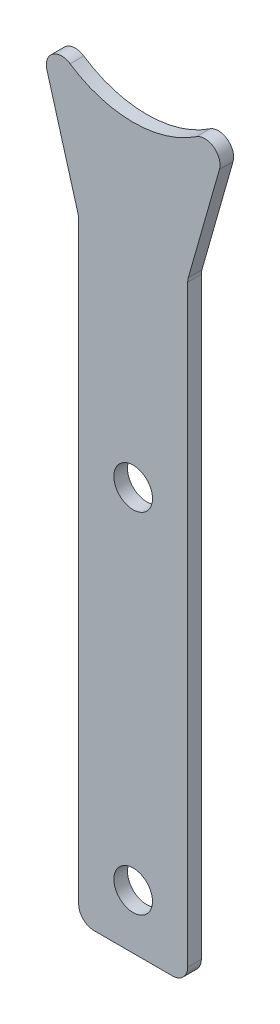
ISO-10303-21;
HEADER;
FILE_DESCRIPTION(('STEP AP214'),'2;1');
FILE_NAME('part.step','',(''),(''),'','','');
FILE_SCHEMA(('AUTOMOTIVE_DESIGN { 1 0 10303 214 1 1 1 1 }'));
ENDSEC;
DATA;
#1=APPLICATION_CONTEXT('core data for automotive mechanical design processes');
#2=APPLICATION_PROTOCOL_DEFINITION('international standard','automotive_design',2000,#1);
#3=PRODUCT_CONTEXT('',#1,'mechanical');
#4=PRODUCT('Part','Part','',(#3));
#5=PRODUCT_RELATED_PRODUCT_CATEGORY('part','',(#4));
#6=PRODUCT_DEFINITION_FORMATION('','',#4);
#7=PRODUCT_DEFINITION_CONTEXT('part definition',#1,'design');
#8=PRODUCT_DEFINITION('design','',#6,#7);
#9=PRODUCT_DEFINITION_SHAPE('','',#8);
#10=(LENGTH_UNIT() NAMED_UNIT(*) SI_UNIT(.MILLI.,.METRE.));
#11=(NAMED_UNIT(*) PLANE_ANGLE_UNIT() SI_UNIT($,.RADIAN.));
#12=(NAMED_UNIT(*) SI_UNIT($,.STERADIAN.) SOLID_ANGLE_UNIT());
#13=UNCERTAINTY_MEASURE_WITH_UNIT(LENGTH_MEASURE(1.E-05),#10,'distance_accuracy_value','');
#14=(GEOMETRIC_REPRESENTATION_CONTEXT(3) GLOBAL_UNCERTAINTY_ASSIGNED_CONTEXT((#13)) GLOBAL_UNIT_ASSIGNED_CONTEXT((#10,
#11,#12)) REPRESENTATION_CONTEXT('',''));
#15=CARTESIAN_POINT('',(0.,0.,0.));
#16=DIRECTION('',(0.,0.,1.));
#17=DIRECTION('',(1.,0.,0.));
#18=AXIS2_PLACEMENT_3D('',#15,#16,#17);
#19=CARTESIAN_POINT('',(-1.44263967348481,71.3066575766387,1.5875));
#20=DIRECTION('',(0.,0.,-1.));
#21=DIRECTION('',(-1.,0.,0.));
#22=AXIS2_PLACEMENT_3D('',#19,#20,#21);
#23=CYLINDRICAL_SURFACE('',#22,13.208);
#24=CARTESIAN_POINT('',(-1.44263967348481,71.3066575766387,0.));
#25=DIRECTION('',(0.,0.,1.));
#26=DIRECTION('',(1.,0.,0.));
#27=AXIS2_PLACEMENT_3D('',#24,#25,#26);
#28=CIRCLE('',#27,13.208);
#29=CARTESIAN_POINT('',(-8.78941206667907,60.3304925176302,0.));
#30=VERTEX_POINT('',#29);
#31=CARTESIAN_POINT('',(5.90413271970945,60.3304925176302,0.));
#32=VERTEX_POINT('',#31);
#33=EDGE_CURVE('E221',#30,#32,#28,.T.);
#34=ORIENTED_EDGE('',*,*,#33,.F.);
#35=DIRECTION('',(0.,0.,-1.));
#36=VECTOR('',#35,1.);
#37=CARTESIAN_POINT('',(-8.78941206667907,60.3304925176302,1.5875));
#38=LINE('',#37,#36);
#39=CARTESIAN_POINT('',(-8.78941206667907,60.3304925176302,1.5875));
#40=VERTEX_POINT('',#39);
#41=EDGE_CURVE('E197',#30,#40,#38,.F.);
#42=ORIENTED_EDGE('',*,*,#41,.T.);
#43=CARTESIAN_POINT('',(-1.44263967348481,71.3066575766387,1.5875));
#44=DIRECTION('',(0.,0.,1.));
#45=DIRECTION('',(1.,0.,0.));
#46=AXIS2_PLACEMENT_3D('',#43,#44,#45);
#47=CIRCLE('',#46,13.208);
#48=CARTESIAN_POINT('',(5.90413271970945,60.3304925176302,1.5875));
#49=VERTEX_POINT('',#48);
#50=EDGE_CURVE('E223',#40,#49,#47,.T.);
#51=ORIENTED_EDGE('',*,*,#50,.T.);
#52=DIRECTION('',(0.,0.,-1.));
#53=VECTOR('',#52,1.);
#54=CARTESIAN_POINT('',(5.90413271970945,60.3304925176302,1.5875));
#55=LINE('',#54,#53);
#56=EDGE_CURVE('E194',#49,#32,#55,.T.);
#57=ORIENTED_EDGE('',*,*,#56,.T.);
#58=EDGE_LOOP('',(#34,#42,#51,#57));
#59=FACE_BOUND('',#58,.T.);
#60=ADVANCED_FACE('F41',(#59),#23,.F.);
#61=CARTESIAN_POINT('',(4.75967664285466,1.35654170097719,1.5875));
#62=DIRECTION('',(0.961703388462805,0.274092306749313,0.));
#63=DIRECTION('',(-0.274092306749313,0.961703388462805,0.));
#64=AXIS2_PLACEMENT_3D('',#61,#62,#63);
#65=PLANE('',#64);
#66=DIRECTION('',(0.274092306749313,-0.961703388462805,0.));
#67=VECTOR('',#66,1.);
#68=CARTESIAN_POINT('',(4.75967664285466,1.35654170097719,0.));
#69=LINE('',#68,#67);
#70=CARTESIAN_POINT('',(-11.4883092827575,58.3655957152096,0.));
#71=VERTEX_POINT('',#70);
#72=CARTESIAN_POINT('',(-7.86073104879794,45.6375687198968,0.));
#73=VERTEX_POINT('',#72);
#74=EDGE_CURVE('E225',#71,#73,#69,.T.);
#75=ORIENTED_EDGE('',*,*,#74,.T.);
#76=DIRECTION('',(0.,0.,-1.));
#77=VECTOR('',#76,1.);
#78=CARTESIAN_POINT('',(-7.86073104879794,45.6375687198968,1.5875));
#79=LINE('',#78,#77);
#80=CARTESIAN_POINT('',(-7.86073104879794,45.6375687198968,1.5875));
#81=VERTEX_POINT('',#80);
#82=EDGE_CURVE('E188',#73,#81,#79,.F.);
#83=ORIENTED_EDGE('',*,*,#82,.T.);
#84=DIRECTION('',(0.274092306749313,-0.961703388462805,0.));
#85=VECTOR('',#84,1.);
#86=CARTESIAN_POINT('',(4.75967664285466,1.35654170097719,1.5875));
#87=LINE('',#86,#85);
#88=CARTESIAN_POINT('',(-11.4883092827575,58.3655957152096,1.5875));
#89=VERTEX_POINT('',#88);
#90=EDGE_CURVE('E248',#89,#81,#87,.T.);
#91=ORIENTED_EDGE('',*,*,#90,.F.);
#92=DIRECTION('',(0.,0.,1.));
#93=VECTOR('',#92,1.);
#94=CARTESIAN_POINT('',(-11.4883092827575,58.3655957152096,0.));
#95=LINE('',#94,#93);
#96=EDGE_CURVE('E185',#89,#71,#95,.F.);
#97=ORIENTED_EDGE('',*,*,#96,.T.);
#98=EDGE_LOOP('',(#75,#83,#91,#97));
#99=FACE_BOUND('',#98,.T.);
#100=ADVANCED_FACE('F283',(#99),#65,.F.);
#101=CARTESIAN_POINT('',(-7.7926396734848,0.,1.5875));
#102=DIRECTION('',(-1.,0.,0.));
#103=DIRECTION('',(0.,0.,1.));
#104=AXIS2_PLACEMENT_3D('',#101,#102,#103);
#105=PLANE('',#104);
#106=DIRECTION('',(0.,1.,0.));
#107=VECTOR('',#106,1.);
#108=CARTESIAN_POINT('',(-7.7926396734848,0.,0.));
#109=LINE('',#108,#107);
#110=CARTESIAN_POINT('',(-7.7926396734848,-23.9433424233613,0.));
#111=VERTEX_POINT('',#110);
#112=CARTESIAN_POINT('',(-7.7926396734848,45.1502325984965,0.));
#113=VERTEX_POINT('',#112);
#114=EDGE_CURVE('E151',#111,#113,#109,.T.);
#115=ORIENTED_EDGE('',*,*,#114,.F.);
#116=DIRECTION('',(0.,0.,-1.));
#117=VECTOR('',#116,1.);
#118=CARTESIAN_POINT('',(-7.7926396734848,-23.9433424233613,1.5875));
#119=LINE('',#118,#117);
#120=CARTESIAN_POINT('',(-7.7926396734848,-23.9433424233613,1.5875));
#121=VERTEX_POINT('',#120);
#122=EDGE_CURVE('E172',#111,#121,#119,.F.);
#123=ORIENTED_EDGE('',*,*,#122,.T.);
#124=DIRECTION('',(0.,1.,0.));
#125=VECTOR('',#124,1.);
#126=CARTESIAN_POINT('',(-7.7926396734848,0.,1.5875));
#127=LINE('',#126,#125);
#128=CARTESIAN_POINT('',(-7.7926396734848,45.1502325984965,1.5875));
#129=VERTEX_POINT('',#128);
#130=EDGE_CURVE('E246',#121,#129,#127,.T.);
#131=ORIENTED_EDGE('',*,*,#130,.T.);
#132=DIRECTION('',(0.,0.,-1.));
#133=VECTOR('',#132,1.);
#134=CARTESIAN_POINT('',(-7.7926396734848,45.1502325984965,1.5875));
#135=LINE('',#134,#133);
#136=EDGE_CURVE('E169',#129,#113,#135,.T.);
#137=ORIENTED_EDGE('',*,*,#136,.T.);
#138=EDGE_LOOP('',(#115,#123,#131,#137));
#139=FACE_BOUND('',#138,.T.);
#140=ADVANCED_FACE('F239',(#139),#105,.T.);
#141=CARTESIAN_POINT('',(0.,-25.7213424233613,1.5875));
#142=DIRECTION('',(0.,-1.,0.));
#143=DIRECTION('',(0.,0.,-1.));
#144=AXIS2_PLACEMENT_3D('',#141,#142,#143);
#145=PLANE('',#144);
#146=DIRECTION('',(-1.,0.,0.));
#147=VECTOR('',#146,1.);
#148=CARTESIAN_POINT('',(0.,-25.7213424233613,1.5875));
#149=LINE('',#148,#147);
#150=CARTESIAN_POINT('',(3.1293603265152,-25.7213424233613,1.5875));
#151=VERTEX_POINT('',#150);
#152=CARTESIAN_POINT('',(-6.0146396734848,-25.7213424233613,1.5875));
#153=VERTEX_POINT('',#152);
#154=EDGE_CURVE('E245',#151,#153,#149,.T.);
#155=ORIENTED_EDGE('',*,*,#154,.T.);
#156=DIRECTION('',(0.,0.,-1.));
#157=VECTOR('',#156,1.);
#158=CARTESIAN_POINT('',(-6.0146396734848,-25.7213424233613,1.5875));
#159=LINE('',#158,#157);
#160=CARTESIAN_POINT('',(-6.0146396734848,-25.7213424233613,0.));
#161=VERTEX_POINT('',#160);
#162=EDGE_CURVE('E150',#153,#161,#159,.T.);
#163=ORIENTED_EDGE('',*,*,#162,.T.);
#164=DIRECTION('',(-1.,0.,0.));
#165=VECTOR('',#164,1.);
#166=CARTESIAN_POINT('',(0.,-25.7213424233613,0.));
#167=LINE('',#166,#165);
#168=CARTESIAN_POINT('',(3.1293603265152,-25.7213424233613,0.));
#169=VERTEX_POINT('',#168);
#170=EDGE_CURVE('E133',#169,#161,#167,.T.);
#171=ORIENTED_EDGE('',*,*,#170,.F.);
#172=DIRECTION('',(0.,0.,-1.));
#173=VECTOR('',#172,1.);
#174=CARTESIAN_POINT('',(3.1293603265152,-25.7213424233613,1.5875));
#175=LINE('',#174,#173);
#176=EDGE_CURVE('E147',#169,#151,#175,.F.);
#177=ORIENTED_EDGE('',*,*,#176,.T.);
#178=EDGE_LOOP('',(#155,#163,#171,#177));
#179=FACE_BOUND('',#178,.T.);
#180=ADVANCED_FACE('F146',(#179),#145,.T.);
#181=CARTESIAN_POINT('',(4.9073603265152,0.,1.5875));
#182=DIRECTION('',(-1.,0.,0.));
#183=DIRECTION('',(0.,0.,1.));
#184=AXIS2_PLACEMENT_3D('',#181,#182,#183);
#185=PLANE('',#184);
#186=DIRECTION('',(0.,1.,0.));
#187=VECTOR('',#186,1.);
#188=CARTESIAN_POINT('',(4.9073603265152,0.,1.5875));
#189=LINE('',#188,#187);
#190=CARTESIAN_POINT('',(4.9073603265152,-23.9433424233613,1.5875));
#191=VERTEX_POINT('',#190);
#192=CARTESIAN_POINT('',(4.9073603265152,45.1502325984965,1.5875));
#193=VERTEX_POINT('',#192);
#194=EDGE_CURVE('E160',#191,#193,#189,.T.);
#195=ORIENTED_EDGE('',*,*,#194,.F.);
#196=DIRECTION('',(0.,0.,-1.));
#197=VECTOR('',#196,1.);
#198=CARTESIAN_POINT('',(4.9073603265152,-23.9433424233613,0.));
#199=LINE('',#198,#197);
#200=CARTESIAN_POINT('',(4.9073603265152,-23.9433424233613,0.));
#201=VERTEX_POINT('',#200);
#202=EDGE_CURVE('E183',#191,#201,#199,.T.);
#203=ORIENTED_EDGE('',*,*,#202,.T.);
#204=DIRECTION('',(0.,1.,0.));
#205=VECTOR('',#204,1.);
#206=CARTESIAN_POINT('',(4.9073603265152,0.,0.));
#207=LINE('',#206,#205);
#208=CARTESIAN_POINT('',(4.9073603265152,45.1502325984965,0.));
#209=VERTEX_POINT('',#208);
#210=EDGE_CURVE('E135',#201,#209,#207,.T.);
#211=ORIENTED_EDGE('',*,*,#210,.T.);
#212=DIRECTION('',(0.,0.,-1.));
#213=VECTOR('',#212,1.);
#214=CARTESIAN_POINT('',(4.9073603265152,45.1502325984965,1.5875));
#215=LINE('',#214,#213);
#216=EDGE_CURVE('E181',#209,#193,#215,.F.);
#217=ORIENTED_EDGE('',*,*,#216,.T.);
#218=EDGE_LOOP('',(#195,#203,#211,#217));
#219=FACE_BOUND('',#218,.T.);
#220=ADVANCED_FACE('F208',(#219),#185,.F.);
#221=CARTESIAN_POINT('',(-7.42819478373197,2.11708835352102,1.5875));
#222=DIRECTION('',(-0.961703388462805,0.274092306749313,0.));
#223=DIRECTION('',(-0.274092306749313,-0.961703388462805,0.));
#224=AXIS2_PLACEMENT_3D('',#221,#222,#223);
#225=PLANE('',#224);
#226=DIRECTION('',(0.274092306749313,0.961703388462805,0.));
#227=VECTOR('',#226,1.);
#228=CARTESIAN_POINT('',(-7.42819478373197,2.11708835352102,1.5875));
#229=LINE('',#228,#227);
#230=CARTESIAN_POINT('',(4.97545170182833,45.6375687198968,1.5875));
#231=VERTEX_POINT('',#230);
#232=CARTESIAN_POINT('',(8.60302993578786,58.3655957152096,1.5875));
#233=VERTEX_POINT('',#232);
#234=EDGE_CURVE('E156',#231,#233,#229,.T.);
#235=ORIENTED_EDGE('',*,*,#234,.F.);
#236=DIRECTION('',(0.,0.,-1.));
#237=VECTOR('',#236,1.);
#238=CARTESIAN_POINT('',(4.97545170182833,45.6375687198968,0.));
#239=LINE('',#238,#237);
#240=CARTESIAN_POINT('',(4.97545170182833,45.6375687198968,0.));
#241=VERTEX_POINT('',#240);
#242=EDGE_CURVE('E191',#231,#241,#239,.T.);
#243=ORIENTED_EDGE('',*,*,#242,.T.);
#244=DIRECTION('',(0.274092306749313,0.961703388462805,0.));
#245=VECTOR('',#244,1.);
#246=CARTESIAN_POINT('',(-7.42819478373197,2.11708835352102,0.));
#247=LINE('',#246,#245);
#248=CARTESIAN_POINT('',(8.60302993578786,58.3655957152096,0.));
#249=VERTEX_POINT('',#248);
#250=EDGE_CURVE('E163',#241,#249,#247,.T.);
#251=ORIENTED_EDGE('',*,*,#250,.T.);
#252=DIRECTION('',(0.,0.,1.));
#253=VECTOR('',#252,1.);
#254=CARTESIAN_POINT('',(8.60302993578786,58.3655957152096,1.5875));
#255=LINE('',#254,#253);
#256=EDGE_CURVE('E56',#249,#233,#255,.T.);
#257=ORIENTED_EDGE('',*,*,#256,.T.);
#258=EDGE_LOOP('',(#235,#243,#251,#257));
#259=FACE_BOUND('',#258,.T.);
#260=ADVANCED_FACE('F210',(#259),#225,.F.);
#261=CARTESIAN_POINT('',(0.,0.,1.5875));
#262=DIRECTION('',(0.,0.,1.));
#263=DIRECTION('',(1.,0.,0.));
#264=AXIS2_PLACEMENT_3D('',#261,#262,#263);
#265=PLANE('',#264);
#266=CARTESIAN_POINT('',(-1.44263967348481,-19.3713424233613,1.5875));
#267=DIRECTION('',(0.,0.,1.));
#268=DIRECTION('',(1.,0.,0.));
#269=AXIS2_PLACEMENT_3D('',#266,#267,#268);
#270=CIRCLE('',#269,2.24999999999999);
#271=CARTESIAN_POINT('',(0.807360326515177,-19.3713424233613,1.5875));
#272=VERTEX_POINT('',#271);
#273=EDGE_CURVE('E259',#272,#272,#270,.T.);
#274=ORIENTED_EDGE('',*,*,#273,.F.);
#275=EDGE_LOOP('',(#274));
#276=FACE_BOUND('',#275,.T.);
#277=CARTESIAN_POINT('',(-1.44263967348481,21.2686575766387,1.5875));
#278=DIRECTION('',(0.,0.,1.));
#279=DIRECTION('',(1.,0.,0.));
#280=AXIS2_PLACEMENT_3D('',#277,#278,#279);
#281=CIRCLE('',#280,2.24999999999999);
#282=CARTESIAN_POINT('',(0.807360326515176,21.2686575766387,1.5875));
#283=VERTEX_POINT('',#282);
#284=EDGE_CURVE('E231',#283,#283,#281,.T.);
#285=ORIENTED_EDGE('',*,*,#284,.F.);
#286=EDGE_LOOP('',(#285));
#287=FACE_BOUND('',#286,.T.);
#288=ORIENTED_EDGE('',*,*,#130,.F.);
#289=CARTESIAN_POINT('',(-6.0146396734848,-23.9433424233613,1.5875));
#290=DIRECTION('',(0.,0.,1.));
#291=DIRECTION('',(1.,0.,0.));
#292=AXIS2_PLACEMENT_3D('',#289,#290,#291);
#293=CIRCLE('',#292,1.778);
#294=EDGE_CURVE('E179',#121,#153,#293,.T.);
#295=ORIENTED_EDGE('',*,*,#294,.T.);
#296=ORIENTED_EDGE('',*,*,#154,.F.);
#297=CARTESIAN_POINT('',(3.1293603265152,-23.9433424233613,1.5875));
#298=DIRECTION('',(0.,0.,1.));
#299=DIRECTION('',(1.,0.,0.));
#300=AXIS2_PLACEMENT_3D('',#297,#298,#299);
#301=CIRCLE('',#300,1.778);
#302=EDGE_CURVE('E155',#151,#191,#301,.T.);
#303=ORIENTED_EDGE('',*,*,#302,.T.);
#304=ORIENTED_EDGE('',*,*,#194,.T.);
#305=CARTESIAN_POINT('',(6.6853603265152,45.1502325984965,1.5875));
#306=DIRECTION('',(0.,0.,1.));
#307=DIRECTION('',(1.,0.,0.));
#308=AXIS2_PLACEMENT_3D('',#305,#306,#307);
#309=CIRCLE('',#308,1.778);
#310=EDGE_CURVE('E11',#193,#231,#309,.F.);
#311=ORIENTED_EDGE('',*,*,#310,.T.);
#312=ORIENTED_EDGE('',*,*,#234,.T.);
#313=CARTESIAN_POINT('',(6.89312131110098,58.8529318366098,1.5875));
#314=DIRECTION('',(0.,0.,1.));
#315=DIRECTION('',(1.,0.,0.));
#316=AXIS2_PLACEMENT_3D('',#313,#314,#315);
#317=CIRCLE('',#316,1.778);
#318=EDGE_CURVE('E174',#233,#49,#317,.T.);
#319=ORIENTED_EDGE('',*,*,#318,.T.);
#320=ORIENTED_EDGE('',*,*,#50,.F.);
#321=CARTESIAN_POINT('',(-9.7784006580706,58.8529318366098,1.5875));
#322=DIRECTION('',(0.,0.,1.));
#323=DIRECTION('',(1.,0.,0.));
#324=AXIS2_PLACEMENT_3D('',#321,#322,#323);
#325=CIRCLE('',#324,1.778);
#326=EDGE_CURVE('E176',#40,#89,#325,.T.);
#327=ORIENTED_EDGE('',*,*,#326,.T.);
#328=ORIENTED_EDGE('',*,*,#90,.T.);
#329=CARTESIAN_POINT('',(-9.5706396734848,45.1502325984965,1.5875));
#330=DIRECTION('',(0.,0.,1.));
#331=DIRECTION('',(1.,0.,0.));
#332=AXIS2_PLACEMENT_3D('',#329,#330,#331);
#333=CIRCLE('',#332,1.778);
#334=EDGE_CURVE('E201',#81,#129,#333,.F.);
#335=ORIENTED_EDGE('',*,*,#334,.T.);
#336=EDGE_LOOP('',(#288,#295,#296,#303,#304,#311,#312,#319,#320,#327,#328,#335));
#337=FACE_BOUND('',#336,.T.);
#338=ADVANCED_FACE('F213',(#276,#287,#337),#265,.T.);
#339=CARTESIAN_POINT('',(0.,0.,0.));
#340=DIRECTION('',(0.,0.,1.));
#341=DIRECTION('',(1.,0.,0.));
#342=AXIS2_PLACEMENT_3D('',#339,#340,#341);
#343=PLANE('',#342);
#344=CARTESIAN_POINT('',(-1.44263967348481,-19.3713424233613,0.));
#345=DIRECTION('',(0.,0.,1.));
#346=DIRECTION('',(1.,0.,0.));
#347=AXIS2_PLACEMENT_3D('',#344,#345,#346);
#348=CIRCLE('',#347,2.25);
#349=CARTESIAN_POINT('',(0.807360326515188,-19.3713424233613,0.));
#350=VERTEX_POINT('',#349);
#351=EDGE_CURVE('E256',#350,#350,#348,.T.);
#352=ORIENTED_EDGE('',*,*,#351,.T.);
#353=EDGE_LOOP('',(#352));
#354=FACE_BOUND('',#353,.T.);
#355=CARTESIAN_POINT('',(-1.44263967348481,21.2686575766387,0.));
#356=DIRECTION('',(0.,0.,1.));
#357=DIRECTION('',(1.,0.,0.));
#358=AXIS2_PLACEMENT_3D('',#355,#356,#357);
#359=CIRCLE('',#358,2.25);
#360=CARTESIAN_POINT('',(0.807360326515188,21.2686575766387,0.));
#361=VERTEX_POINT('',#360);
#362=EDGE_CURVE('E226',#361,#361,#359,.T.);
#363=ORIENTED_EDGE('',*,*,#362,.T.);
#364=EDGE_LOOP('',(#363));
#365=FACE_BOUND('',#364,.T.);
#366=ORIENTED_EDGE('',*,*,#170,.T.);
#367=CARTESIAN_POINT('',(-6.0146396734848,-23.9433424233613,0.));
#368=DIRECTION('',(0.,0.,1.));
#369=DIRECTION('',(1.,0.,0.));
#370=AXIS2_PLACEMENT_3D('',#367,#368,#369);
#371=CIRCLE('',#370,1.778);
#372=EDGE_CURVE('E140',#161,#111,#371,.F.);
#373=ORIENTED_EDGE('',*,*,#372,.T.);
#374=ORIENTED_EDGE('',*,*,#114,.T.);
#375=CARTESIAN_POINT('',(-9.5706396734848,45.1502325984965,0.));
#376=DIRECTION('',(0.,0.,1.));
#377=DIRECTION('',(1.,0.,0.));
#378=AXIS2_PLACEMENT_3D('',#375,#376,#377);
#379=CIRCLE('',#378,1.778);
#380=EDGE_CURVE('E199',#113,#73,#379,.T.);
#381=ORIENTED_EDGE('',*,*,#380,.T.);
#382=ORIENTED_EDGE('',*,*,#74,.F.);
#383=CARTESIAN_POINT('',(-9.7784006580706,58.8529318366098,0.));
#384=DIRECTION('',(0.,0.,1.));
#385=DIRECTION('',(1.,0.,0.));
#386=AXIS2_PLACEMENT_3D('',#383,#384,#385);
#387=CIRCLE('',#386,1.778);
#388=EDGE_CURVE('E141',#71,#30,#387,.F.);
#389=ORIENTED_EDGE('',*,*,#388,.T.);
#390=ORIENTED_EDGE('',*,*,#33,.T.);
#391=CARTESIAN_POINT('',(6.89312131110098,58.8529318366098,0.));
#392=DIRECTION('',(0.,0.,1.));
#393=DIRECTION('',(1.,0.,0.));
#394=AXIS2_PLACEMENT_3D('',#391,#392,#393);
#395=CIRCLE('',#394,1.778);
#396=EDGE_CURVE('E158',#32,#249,#395,.F.);
#397=ORIENTED_EDGE('',*,*,#396,.T.);
#398=ORIENTED_EDGE('',*,*,#250,.F.);
#399=CARTESIAN_POINT('',(6.6853603265152,45.1502325984965,0.));
#400=DIRECTION('',(0.,0.,1.));
#401=DIRECTION('',(1.,0.,0.));
#402=AXIS2_PLACEMENT_3D('',#399,#400,#401);
#403=CIRCLE('',#402,1.778);
#404=EDGE_CURVE('E49',#241,#209,#403,.T.);
#405=ORIENTED_EDGE('',*,*,#404,.T.);
#406=ORIENTED_EDGE('',*,*,#210,.F.);
#407=CARTESIAN_POINT('',(3.1293603265152,-23.9433424233613,0.));
#408=DIRECTION('',(0.,0.,1.));
#409=DIRECTION('',(1.,0.,0.));
#410=AXIS2_PLACEMENT_3D('',#407,#408,#409);
#411=CIRCLE('',#410,1.778);
#412=EDGE_CURVE('E130',#201,#169,#411,.F.);
#413=ORIENTED_EDGE('',*,*,#412,.T.);
#414=EDGE_LOOP('',(#366,#373,#374,#381,#382,#389,#390,#397,#398,#405,#406,#413));
#415=FACE_BOUND('',#414,.T.);
#416=ADVANCED_FACE('F132',(#354,#365,#415),#343,.F.);
#417=CARTESIAN_POINT('',(-6.0146396734848,-23.9433424233613,1.5875));
#418=DIRECTION('',(0.,0.,-1.));
#419=DIRECTION('',(-1.,0.,0.));
#420=AXIS2_PLACEMENT_3D('',#417,#418,#419);
#421=CYLINDRICAL_SURFACE('',#420,1.778);
#422=ORIENTED_EDGE('',*,*,#294,.F.);
#423=ORIENTED_EDGE('',*,*,#122,.F.);
#424=ORIENTED_EDGE('',*,*,#372,.F.);
#425=ORIENTED_EDGE('',*,*,#162,.F.);
#426=EDGE_LOOP('',(#422,#423,#424,#425));
#427=FACE_BOUND('',#426,.T.);
#428=ADVANCED_FACE('F244',(#427),#421,.T.);
#429=CARTESIAN_POINT('',(3.1293603265152,-23.9433424233613,1.5875));
#430=DIRECTION('',(0.,0.,1.));
#431=DIRECTION('',(1.,0.,0.));
#432=AXIS2_PLACEMENT_3D('',#429,#430,#431);
#433=CYLINDRICAL_SURFACE('',#432,1.778);
#434=ORIENTED_EDGE('',*,*,#302,.F.);
#435=ORIENTED_EDGE('',*,*,#176,.F.);
#436=ORIENTED_EDGE('',*,*,#412,.F.);
#437=ORIENTED_EDGE('',*,*,#202,.F.);
#438=EDGE_LOOP('',(#434,#435,#436,#437));
#439=FACE_BOUND('',#438,.T.);
#440=ADVANCED_FACE('F154',(#439),#433,.T.);
#441=CARTESIAN_POINT('',(-9.5706396734848,45.1502325984965,1.5875));
#442=DIRECTION('',(0.,0.,-1.));
#443=DIRECTION('',(-1.,0.,0.));
#444=AXIS2_PLACEMENT_3D('',#441,#442,#443);
#445=CYLINDRICAL_SURFACE('',#444,1.778);
#446=ORIENTED_EDGE('',*,*,#334,.F.);
#447=ORIENTED_EDGE('',*,*,#82,.F.);
#448=ORIENTED_EDGE('',*,*,#380,.F.);
#449=ORIENTED_EDGE('',*,*,#136,.F.);
#450=EDGE_LOOP('',(#446,#447,#448,#449));
#451=FACE_BOUND('',#450,.T.);
#452=ADVANCED_FACE('F296',(#451),#445,.F.);
#453=CARTESIAN_POINT('',(6.6853603265152,45.1502325984965,1.5875));
#454=DIRECTION('',(0.,0.,1.));
#455=DIRECTION('',(1.,0.,0.));
#456=AXIS2_PLACEMENT_3D('',#453,#454,#455);
#457=CYLINDRICAL_SURFACE('',#456,1.778);
#458=ORIENTED_EDGE('',*,*,#310,.F.);
#459=ORIENTED_EDGE('',*,*,#216,.F.);
#460=ORIENTED_EDGE('',*,*,#404,.F.);
#461=ORIENTED_EDGE('',*,*,#242,.F.);
#462=EDGE_LOOP('',(#458,#459,#460,#461));
#463=FACE_BOUND('',#462,.T.);
#464=ADVANCED_FACE('F209',(#463),#457,.F.);
#465=CARTESIAN_POINT('',(-9.7784006580706,58.8529318366098,1.5875));
#466=DIRECTION('',(0.,0.,-1.));
#467=DIRECTION('',(-1.,0.,0.));
#468=AXIS2_PLACEMENT_3D('',#465,#466,#467);
#469=CYLINDRICAL_SURFACE('',#468,1.778);
#470=ORIENTED_EDGE('',*,*,#326,.F.);
#471=ORIENTED_EDGE('',*,*,#41,.F.);
#472=ORIENTED_EDGE('',*,*,#388,.F.);
#473=ORIENTED_EDGE('',*,*,#96,.F.);
#474=EDGE_LOOP('',(#470,#471,#472,#473));
#475=FACE_BOUND('',#474,.T.);
#476=ADVANCED_FACE('F280',(#475),#469,.T.);
#477=CARTESIAN_POINT('',(6.89312131110098,58.8529318366098,1.5875));
#478=DIRECTION('',(0.,0.,-1.));
#479=DIRECTION('',(-1.,0.,0.));
#480=AXIS2_PLACEMENT_3D('',#477,#478,#479);
#481=CYLINDRICAL_SURFACE('',#480,1.778);
#482=ORIENTED_EDGE('',*,*,#318,.F.);
#483=ORIENTED_EDGE('',*,*,#256,.F.);
#484=ORIENTED_EDGE('',*,*,#396,.F.);
#485=ORIENTED_EDGE('',*,*,#56,.F.);
#486=EDGE_LOOP('',(#482,#483,#484,#485));
#487=FACE_BOUND('',#486,.T.);
#488=ADVANCED_FACE('F43',(#487),#481,.T.);
#489=CARTESIAN_POINT('',(-1.44263967348481,21.2686575766387,1.5875));
#490=DIRECTION('',(0.,0.,1.));
#491=DIRECTION('',(1.,0.,0.));
#492=AXIS2_PLACEMENT_3D('',#489,#490,#491);
#493=CYLINDRICAL_SURFACE('',#492,2.24999999999999);
#494=ORIENTED_EDGE('',*,*,#362,.F.);
#495=EDGE_LOOP('',(#494));
#496=FACE_BOUND('',#495,.T.);
#497=ORIENTED_EDGE('',*,*,#284,.T.);
#498=EDGE_LOOP('',(#497));
#499=FACE_BOUND('',#498,.T.);
#500=ADVANCED_FACE('F270',(#496,#499),#493,.F.);
#501=CARTESIAN_POINT('',(-1.44263967348481,-19.3713424233613,1.5875));
#502=DIRECTION('',(0.,0.,1.));
#503=DIRECTION('',(1.,0.,0.));
#504=AXIS2_PLACEMENT_3D('',#501,#502,#503);
#505=CYLINDRICAL_SURFACE('',#504,2.24999999999999);
#506=ORIENTED_EDGE('',*,*,#351,.F.);
#507=EDGE_LOOP('',(#506));
#508=FACE_BOUND('',#507,.T.);
#509=ORIENTED_EDGE('',*,*,#273,.T.);
#510=EDGE_LOOP('',(#509));
#511=FACE_BOUND('',#510,.T.);
#512=ADVANCED_FACE('F263',(#508,#511),#505,.F.);
#513=CLOSED_SHELL('',(#60,#100,#140,#180,#220,#260,#338,#416,#428,#440,#452,#464,#476,#488,#500,#512));
#514=MANIFOLD_SOLID_BREP('B2',#513);
#515=ADVANCED_BREP_SHAPE_REPRESENTATION('',(#18,#514),#14);
#516=SHAPE_DEFINITION_REPRESENTATION(#9,#515);
ENDSEC;
END-ISO-10303-21;
